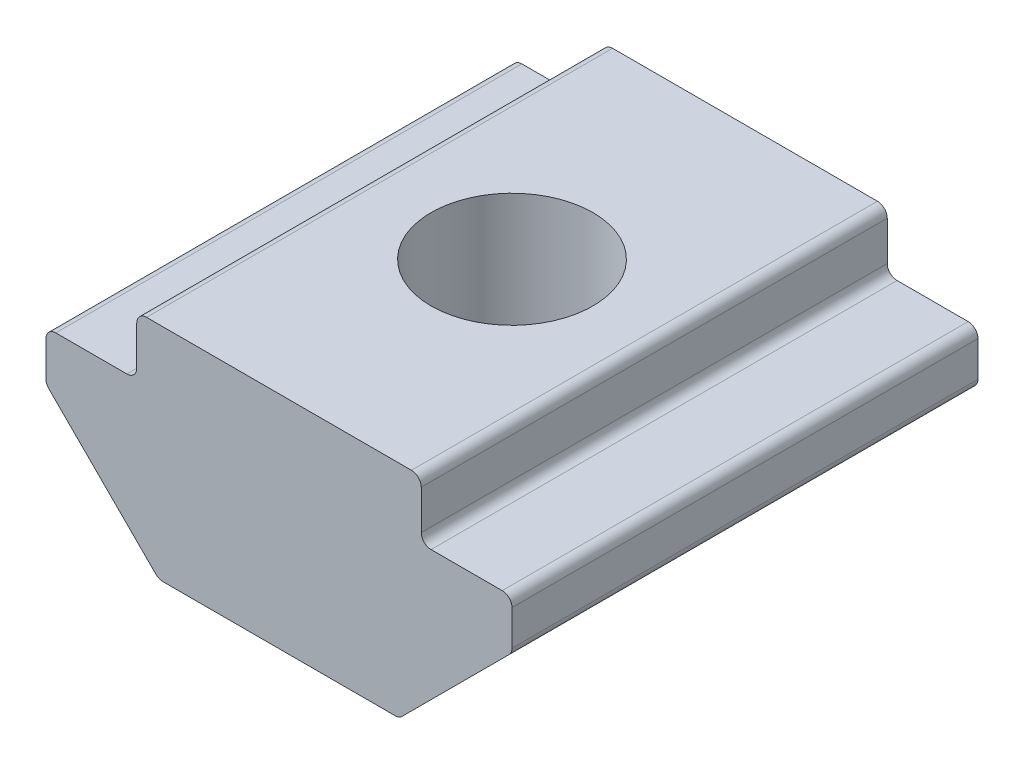
ISO-10303-21;
HEADER;
FILE_DESCRIPTION(('STEP AP214'),'2;1');
FILE_NAME('part.step','',(''),(''),'','','');
FILE_SCHEMA(('AUTOMOTIVE_DESIGN { 1 0 10303 214 1 1 1 1 }'));
ENDSEC;
DATA;
#1=APPLICATION_CONTEXT('core data for automotive mechanical design processes');
#2=APPLICATION_PROTOCOL_DEFINITION('international standard','automotive_design',2000,#1);
#3=PRODUCT_CONTEXT('',#1,'mechanical');
#4=PRODUCT('Part','Part','',(#3));
#5=PRODUCT_RELATED_PRODUCT_CATEGORY('part','',(#4));
#6=PRODUCT_DEFINITION_FORMATION('','',#4);
#7=PRODUCT_DEFINITION_CONTEXT('part definition',#1,'design');
#8=PRODUCT_DEFINITION('design','',#6,#7);
#9=PRODUCT_DEFINITION_SHAPE('','',#8);
#10=(LENGTH_UNIT() NAMED_UNIT(*) SI_UNIT(.MILLI.,.METRE.));
#11=(NAMED_UNIT(*) PLANE_ANGLE_UNIT() SI_UNIT($,.RADIAN.));
#12=(NAMED_UNIT(*) SI_UNIT($,.STERADIAN.) SOLID_ANGLE_UNIT());
#13=UNCERTAINTY_MEASURE_WITH_UNIT(LENGTH_MEASURE(1.E-05),#10,'distance_accuracy_value','');
#14=(GEOMETRIC_REPRESENTATION_CONTEXT(3) GLOBAL_UNCERTAINTY_ASSIGNED_CONTEXT((#13)) GLOBAL_UNIT_ASSIGNED_CONTEXT((#10,
#11,#12)) REPRESENTATION_CONTEXT('',''));
#15=CARTESIAN_POINT('',(0.,0.,0.));
#16=DIRECTION('',(0.,0.,1.));
#17=DIRECTION('',(1.,0.,0.));
#18=AXIS2_PLACEMENT_3D('',#15,#16,#17);
#19=CARTESIAN_POINT('',(-2.9,0.,4.75));
#20=DIRECTION('',(1.,0.,0.));
#21=DIRECTION('',(0.,1.,0.));
#22=AXIS2_PLACEMENT_3D('',#19,#20,#21);
#23=PLANE('',#22);
#24=DIRECTION('',(0.,-1.,0.));
#25=VECTOR('',#24,1.);
#26=CARTESIAN_POINT('',(-2.9,0.,-4.75));
#27=LINE('',#26,#25);
#28=CARTESIAN_POINT('',(-2.9,-0.2,-4.75));
#29=VERTEX_POINT('',#28);
#30=CARTESIAN_POINT('',(-2.9,-1.,-4.75));
#31=VERTEX_POINT('',#30);
#32=EDGE_CURVE('E183',#29,#31,#27,.T.);
#33=ORIENTED_EDGE('',*,*,#32,.T.);
#34=DIRECTION('',(0.,0.,-1.));
#35=VECTOR('',#34,1.);
#36=CARTESIAN_POINT('',(-2.9,-1.,4.75));
#37=LINE('',#36,#35);
#38=CARTESIAN_POINT('',(-2.9,-1.,4.75));
#39=VERTEX_POINT('',#38);
#40=EDGE_CURVE('E160',#31,#39,#37,.F.);
#41=ORIENTED_EDGE('',*,*,#40,.T.);
#42=DIRECTION('',(0.,-1.,0.));
#43=VECTOR('',#42,1.);
#44=CARTESIAN_POINT('',(-2.9,0.,4.75));
#45=LINE('',#44,#43);
#46=CARTESIAN_POINT('',(-2.9,-0.2,4.75));
#47=VERTEX_POINT('',#46);
#48=EDGE_CURVE('E211',#47,#39,#45,.T.);
#49=ORIENTED_EDGE('',*,*,#48,.F.);
#50=DIRECTION('',(0.,0.,-1.));
#51=VECTOR('',#50,1.);
#52=CARTESIAN_POINT('',(-2.9,-0.2,4.75));
#53=LINE('',#52,#51);
#54=EDGE_CURVE('E175',#47,#29,#53,.T.);
#55=ORIENTED_EDGE('',*,*,#54,.T.);
#56=EDGE_LOOP('',(#33,#41,#49,#55));
#57=FACE_BOUND('',#56,.T.);
#58=ADVANCED_FACE('F17',(#57),#23,.F.);
#59=CARTESIAN_POINT('',(-2.9,-1.2,4.75));
#60=DIRECTION('',(0.,-1.,0.));
#61=DIRECTION('',(1.,0.,0.));
#62=AXIS2_PLACEMENT_3D('',#59,#60,#61);
#63=PLANE('',#62);
#64=DIRECTION('',(-1.,0.,0.));
#65=VECTOR('',#64,1.);
#66=CARTESIAN_POINT('',(-2.9,-1.2,4.75));
#67=LINE('',#66,#65);
#68=CARTESIAN_POINT('',(-3.1,-1.2,4.75));
#69=VERTEX_POINT('',#68);
#70=CARTESIAN_POINT('',(-4.55,-1.2,4.75));
#71=VERTEX_POINT('',#70);
#72=EDGE_CURVE('E174',#69,#71,#67,.T.);
#73=ORIENTED_EDGE('',*,*,#72,.F.);
#74=DIRECTION('',(0.,0.,-1.));
#75=VECTOR('',#74,1.);
#76=CARTESIAN_POINT('',(-3.1,-1.2,-4.75));
#77=LINE('',#76,#75);
#78=CARTESIAN_POINT('',(-3.1,-1.2,-4.75));
#79=VERTEX_POINT('',#78);
#80=EDGE_CURVE('E159',#69,#79,#77,.T.);
#81=ORIENTED_EDGE('',*,*,#80,.T.);
#82=DIRECTION('',(-1.,0.,0.));
#83=VECTOR('',#82,1.);
#84=CARTESIAN_POINT('',(-2.9,-1.2,-4.75));
#85=LINE('',#84,#83);
#86=CARTESIAN_POINT('',(-4.55,-1.2,-4.75));
#87=VERTEX_POINT('',#86);
#88=EDGE_CURVE('E171',#79,#87,#85,.T.);
#89=ORIENTED_EDGE('',*,*,#88,.T.);
#90=DIRECTION('',(0.,0.,-1.));
#91=VECTOR('',#90,1.);
#92=CARTESIAN_POINT('',(-4.55,-1.2,4.75));
#93=LINE('',#92,#91);
#94=EDGE_CURVE('E176',#87,#71,#93,.F.);
#95=ORIENTED_EDGE('',*,*,#94,.T.);
#96=EDGE_LOOP('',(#73,#81,#89,#95));
#97=FACE_BOUND('',#96,.T.);
#98=ADVANCED_FACE('F170',(#97),#63,.F.);
#99=CARTESIAN_POINT('',(-4.75,-1.2,4.75));
#100=DIRECTION('',(1.,0.,0.));
#101=DIRECTION('',(0.,0.,-1.));
#102=AXIS2_PLACEMENT_3D('',#99,#100,#101);
#103=PLANE('',#102);
#104=DIRECTION('',(0.,-1.,0.));
#105=VECTOR('',#104,1.);
#106=CARTESIAN_POINT('',(-4.75,-1.2,-4.75));
#107=LINE('',#106,#105);
#108=CARTESIAN_POINT('',(-4.75,-1.4,-4.75));
#109=VERTEX_POINT('',#108);
#110=CARTESIAN_POINT('',(-4.75,-2.11715728752538,-4.75));
#111=VERTEX_POINT('',#110);
#112=EDGE_CURVE('E182',#109,#111,#107,.T.);
#113=ORIENTED_EDGE('',*,*,#112,.T.);
#114=DIRECTION('',(0.,0.,-1.));
#115=VECTOR('',#114,1.);
#116=CARTESIAN_POINT('',(-4.75,-2.11715728752538,4.75));
#117=LINE('',#116,#115);
#118=CARTESIAN_POINT('',(-4.75,-2.11715728752538,4.75));
#119=VERTEX_POINT('',#118);
#120=EDGE_CURVE('E250',#111,#119,#117,.F.);
#121=ORIENTED_EDGE('',*,*,#120,.T.);
#122=DIRECTION('',(0.,-1.,0.));
#123=VECTOR('',#122,1.);
#124=CARTESIAN_POINT('',(-4.75,-1.2,4.75));
#125=LINE('',#124,#123);
#126=CARTESIAN_POINT('',(-4.75,-1.4,4.75));
#127=VERTEX_POINT('',#126);
#128=EDGE_CURVE('E321',#127,#119,#125,.T.);
#129=ORIENTED_EDGE('',*,*,#128,.F.);
#130=DIRECTION('',(0.,0.,-1.));
#131=VECTOR('',#130,1.);
#132=CARTESIAN_POINT('',(-4.75,-1.4,4.75));
#133=LINE('',#132,#131);
#134=EDGE_CURVE('E247',#127,#109,#133,.T.);
#135=ORIENTED_EDGE('',*,*,#134,.T.);
#136=EDGE_LOOP('',(#113,#121,#129,#135));
#137=FACE_BOUND('',#136,.T.);
#138=ADVANCED_FACE('F352',(#137),#103,.F.);
#139=CARTESIAN_POINT('',(-4.75,-2.2,4.75));
#140=DIRECTION('',(0.707106781186546,0.707106781186549,0.));
#141=DIRECTION('',(-0.707106781186549,0.707106781186546,0.));
#142=AXIS2_PLACEMENT_3D('',#139,#140,#141);
#143=PLANE('',#142);
#144=DIRECTION('',(0.707106781186549,-0.707106781186546,0.));
#145=VECTOR('',#144,1.);
#146=CARTESIAN_POINT('',(-4.75,-2.2,4.75));
#147=LINE('',#146,#145);
#148=CARTESIAN_POINT('',(-4.69142135623731,-2.25857864376269,4.75));
#149=VERTEX_POINT('',#148);
#150=CARTESIAN_POINT('',(-2.50857864376268,-4.44142135623731,4.75));
#151=VERTEX_POINT('',#150);
#152=EDGE_CURVE('E318',#149,#151,#147,.T.);
#153=ORIENTED_EDGE('',*,*,#152,.F.);
#154=DIRECTION('',(0.,0.,-1.));
#155=VECTOR('',#154,1.);
#156=CARTESIAN_POINT('',(-4.69142135623731,-2.25857864376269,4.75));
#157=LINE('',#156,#155);
#158=CARTESIAN_POINT('',(-4.69142135623731,-2.25857864376269,-4.75));
#159=VERTEX_POINT('',#158);
#160=EDGE_CURVE('E229',#149,#159,#157,.T.);
#161=ORIENTED_EDGE('',*,*,#160,.T.);
#162=DIRECTION('',(0.707106781186549,-0.707106781186546,0.));
#163=VECTOR('',#162,1.);
#164=CARTESIAN_POINT('',(-4.75,-2.2,-4.75));
#165=LINE('',#164,#163);
#166=CARTESIAN_POINT('',(-2.50857864376268,-4.44142135623731,-4.75));
#167=VERTEX_POINT('',#166);
#168=EDGE_CURVE('E186',#159,#167,#165,.T.);
#169=ORIENTED_EDGE('',*,*,#168,.T.);
#170=DIRECTION('',(0.,0.,-1.));
#171=VECTOR('',#170,1.);
#172=CARTESIAN_POINT('',(-2.50857864376268,-4.44142135623731,4.75));
#173=LINE('',#172,#171);
#174=EDGE_CURVE('E227',#167,#151,#173,.F.);
#175=ORIENTED_EDGE('',*,*,#174,.T.);
#176=EDGE_LOOP('',(#153,#161,#169,#175));
#177=FACE_BOUND('',#176,.T.);
#178=ADVANCED_FACE('F527',(#177),#143,.F.);
#179=CARTESIAN_POINT('',(-2.45,-4.5,4.75));
#180=DIRECTION('',(0.,1.,0.));
#181=DIRECTION('',(-1.,0.,0.));
#182=AXIS2_PLACEMENT_3D('',#179,#180,#181);
#183=PLANE('',#182);
#184=CARTESIAN_POINT('',(0.,-4.5,0.));
#185=DIRECTION('',(0.,1.,0.));
#186=DIRECTION('',(0.,0.,1.));
#187=AXIS2_PLACEMENT_3D('',#184,#185,#186);
#188=CIRCLE('',#187,1.65);
#189=CARTESIAN_POINT('',(0.,-4.5,1.65));
#190=VERTEX_POINT('',#189);
#191=EDGE_CURVE('E188',#190,#190,#188,.T.);
#192=ORIENTED_EDGE('',*,*,#191,.T.);
#193=EDGE_LOOP('',(#192));
#194=FACE_BOUND('',#193,.T.);
#195=DIRECTION('',(1.,0.,0.));
#196=VECTOR('',#195,1.);
#197=CARTESIAN_POINT('',(-2.45,-4.5,4.75));
#198=LINE('',#197,#196);
#199=CARTESIAN_POINT('',(-2.36715728752537,-4.5,4.75));
#200=VERTEX_POINT('',#199);
#201=CARTESIAN_POINT('',(2.36715728752537,-4.5,4.75));
#202=VERTEX_POINT('',#201);
#203=EDGE_CURVE('E315',#200,#202,#198,.T.);
#204=ORIENTED_EDGE('',*,*,#203,.F.);
#205=DIRECTION('',(0.,0.,-1.));
#206=VECTOR('',#205,1.);
#207=CARTESIAN_POINT('',(-2.36715728752537,-4.5,4.75));
#208=LINE('',#207,#206);
#209=CARTESIAN_POINT('',(-2.36715728752537,-4.5,-4.75));
#210=VERTEX_POINT('',#209);
#211=EDGE_CURVE('E269',#200,#210,#208,.T.);
#212=ORIENTED_EDGE('',*,*,#211,.T.);
#213=DIRECTION('',(1.,0.,0.));
#214=VECTOR('',#213,1.);
#215=CARTESIAN_POINT('',(-2.45,-4.5,-4.75));
#216=LINE('',#215,#214);
#217=CARTESIAN_POINT('',(2.36715728752537,-4.5,-4.75));
#218=VERTEX_POINT('',#217);
#219=EDGE_CURVE('E194',#210,#218,#216,.T.);
#220=ORIENTED_EDGE('',*,*,#219,.T.);
#221=DIRECTION('',(0.,0.,-1.));
#222=VECTOR('',#221,1.);
#223=CARTESIAN_POINT('',(2.36715728752537,-4.5,4.75));
#224=LINE('',#223,#222);
#225=EDGE_CURVE('E267',#218,#202,#224,.F.);
#226=ORIENTED_EDGE('',*,*,#225,.T.);
#227=EDGE_LOOP('',(#204,#212,#220,#226));
#228=FACE_BOUND('',#227,.T.);
#229=ADVANCED_FACE('F517',(#194,#228),#183,.F.);
#230=CARTESIAN_POINT('',(4.75,-2.2,4.75));
#231=DIRECTION('',(-0.707106781186546,0.707106781186549,0.));
#232=DIRECTION('',(-0.707106781186549,-0.707106781186546,0.));
#233=AXIS2_PLACEMENT_3D('',#230,#231,#232);
#234=PLANE('',#233);
#235=DIRECTION('',(0.707106781186549,0.707106781186546,0.));
#236=VECTOR('',#235,1.);
#237=CARTESIAN_POINT('',(4.75,-2.2,4.75));
#238=LINE('',#237,#236);
#239=CARTESIAN_POINT('',(2.50857864376268,-4.44142135623731,4.75));
#240=VERTEX_POINT('',#239);
#241=CARTESIAN_POINT('',(4.69142135623731,-2.25857864376269,4.75));
#242=VERTEX_POINT('',#241);
#243=EDGE_CURVE('E312',#240,#242,#238,.T.);
#244=ORIENTED_EDGE('',*,*,#243,.F.);
#245=DIRECTION('',(0.,0.,-1.));
#246=VECTOR('',#245,1.);
#247=CARTESIAN_POINT('',(2.50857864376268,-4.44142135623731,4.75));
#248=LINE('',#247,#246);
#249=CARTESIAN_POINT('',(2.50857864376268,-4.44142135623731,-4.75));
#250=VERTEX_POINT('',#249);
#251=EDGE_CURVE('E274',#240,#250,#248,.T.);
#252=ORIENTED_EDGE('',*,*,#251,.T.);
#253=DIRECTION('',(0.707106781186549,0.707106781186546,0.));
#254=VECTOR('',#253,1.);
#255=CARTESIAN_POINT('',(4.75,-2.2,-4.75));
#256=LINE('',#255,#254);
#257=CARTESIAN_POINT('',(4.69142135623731,-2.25857864376269,-4.75));
#258=VERTEX_POINT('',#257);
#259=EDGE_CURVE('E197',#250,#258,#256,.T.);
#260=ORIENTED_EDGE('',*,*,#259,.T.);
#261=DIRECTION('',(0.,0.,-1.));
#262=VECTOR('',#261,1.);
#263=CARTESIAN_POINT('',(4.69142135623731,-2.25857864376269,4.75));
#264=LINE('',#263,#262);
#265=EDGE_CURVE('E272',#258,#242,#264,.F.);
#266=ORIENTED_EDGE('',*,*,#265,.T.);
#267=EDGE_LOOP('',(#244,#252,#260,#266));
#268=FACE_BOUND('',#267,.T.);
#269=ADVANCED_FACE('F507',(#268),#234,.F.);
#270=CARTESIAN_POINT('',(4.75,-1.2,4.75));
#271=DIRECTION('',(-1.,0.,0.));
#272=DIRECTION('',(0.,0.,1.));
#273=AXIS2_PLACEMENT_3D('',#270,#271,#272);
#274=PLANE('',#273);
#275=DIRECTION('',(0.,1.,0.));
#276=VECTOR('',#275,1.);
#277=CARTESIAN_POINT('',(4.75,-1.2,4.75));
#278=LINE('',#277,#276);
#279=CARTESIAN_POINT('',(4.75,-2.11715728752538,4.75));
#280=VERTEX_POINT('',#279);
#281=CARTESIAN_POINT('',(4.75,-1.4,4.75));
#282=VERTEX_POINT('',#281);
#283=EDGE_CURVE('E307',#280,#282,#278,.T.);
#284=ORIENTED_EDGE('',*,*,#283,.F.);
#285=DIRECTION('',(0.,0.,-1.));
#286=VECTOR('',#285,1.);
#287=CARTESIAN_POINT('',(4.75,-2.11715728752538,4.75));
#288=LINE('',#287,#286);
#289=CARTESIAN_POINT('',(4.75,-2.11715728752538,-4.75));
#290=VERTEX_POINT('',#289);
#291=EDGE_CURVE('E279',#280,#290,#288,.T.);
#292=ORIENTED_EDGE('',*,*,#291,.T.);
#293=DIRECTION('',(0.,1.,0.));
#294=VECTOR('',#293,1.);
#295=CARTESIAN_POINT('',(4.75,-1.2,-4.75));
#296=LINE('',#295,#294);
#297=CARTESIAN_POINT('',(4.75,-1.4,-4.75));
#298=VERTEX_POINT('',#297);
#299=EDGE_CURVE('E200',#290,#298,#296,.T.);
#300=ORIENTED_EDGE('',*,*,#299,.T.);
#301=DIRECTION('',(0.,0.,-1.));
#302=VECTOR('',#301,1.);
#303=CARTESIAN_POINT('',(4.75,-1.4,4.75));
#304=LINE('',#303,#302);
#305=EDGE_CURVE('E277',#298,#282,#304,.F.);
#306=ORIENTED_EDGE('',*,*,#305,.T.);
#307=EDGE_LOOP('',(#284,#292,#300,#306));
#308=FACE_BOUND('',#307,.T.);
#309=ADVANCED_FACE('F498',(#308),#274,.F.);
#310=CARTESIAN_POINT('',(2.9,-1.2,4.75));
#311=DIRECTION('',(0.,-1.,0.));
#312=DIRECTION('',(1.,0.,0.));
#313=AXIS2_PLACEMENT_3D('',#310,#311,#312);
#314=PLANE('',#313);
#315=DIRECTION('',(-1.,0.,0.));
#316=VECTOR('',#315,1.);
#317=CARTESIAN_POINT('',(2.9,-1.2,-4.75));
#318=LINE('',#317,#316);
#319=CARTESIAN_POINT('',(4.55,-1.2,-4.75));
#320=VERTEX_POINT('',#319);
#321=CARTESIAN_POINT('',(3.1,-1.2,-4.75));
#322=VERTEX_POINT('',#321);
#323=EDGE_CURVE('E203',#320,#322,#318,.T.);
#324=ORIENTED_EDGE('',*,*,#323,.T.);
#325=DIRECTION('',(0.,0.,-1.));
#326=VECTOR('',#325,1.);
#327=CARTESIAN_POINT('',(3.1,-1.2,4.75));
#328=LINE('',#327,#326);
#329=CARTESIAN_POINT('',(3.1,-1.2,4.75));
#330=VERTEX_POINT('',#329);
#331=EDGE_CURVE('E225',#322,#330,#328,.F.);
#332=ORIENTED_EDGE('',*,*,#331,.T.);
#333=DIRECTION('',(-1.,0.,0.));
#334=VECTOR('',#333,1.);
#335=CARTESIAN_POINT('',(2.9,-1.2,4.75));
#336=LINE('',#335,#334);
#337=CARTESIAN_POINT('',(4.55,-1.2,4.75));
#338=VERTEX_POINT('',#337);
#339=EDGE_CURVE('E302',#338,#330,#336,.T.);
#340=ORIENTED_EDGE('',*,*,#339,.F.);
#341=DIRECTION('',(0.,0.,-1.));
#342=VECTOR('',#341,1.);
#343=CARTESIAN_POINT('',(4.55,-1.2,4.75));
#344=LINE('',#343,#342);
#345=EDGE_CURVE('E222',#338,#320,#344,.T.);
#346=ORIENTED_EDGE('',*,*,#345,.T.);
#347=EDGE_LOOP('',(#324,#332,#340,#346));
#348=FACE_BOUND('',#347,.T.);
#349=ADVANCED_FACE('F292',(#348),#314,.F.);
#350=CARTESIAN_POINT('',(2.9,0.,4.75));
#351=DIRECTION('',(-1.,0.,0.));
#352=DIRECTION('',(0.,-1.,0.));
#353=AXIS2_PLACEMENT_3D('',#350,#351,#352);
#354=PLANE('',#353);
#355=DIRECTION('',(0.,1.,0.));
#356=VECTOR('',#355,1.);
#357=CARTESIAN_POINT('',(2.9,0.,4.75));
#358=LINE('',#357,#356);
#359=CARTESIAN_POINT('',(2.9,-1.,4.75));
#360=VERTEX_POINT('',#359);
#361=CARTESIAN_POINT('',(2.9,-0.2,4.75));
#362=VERTEX_POINT('',#361);
#363=EDGE_CURVE('E301',#360,#362,#358,.T.);
#364=ORIENTED_EDGE('',*,*,#363,.F.);
#365=DIRECTION('',(0.,0.,-1.));
#366=VECTOR('',#365,1.);
#367=CARTESIAN_POINT('',(2.9,-1.,-4.75));
#368=LINE('',#367,#366);
#369=CARTESIAN_POINT('',(2.9,-1.,-4.75));
#370=VERTEX_POINT('',#369);
#371=EDGE_CURVE('E219',#360,#370,#368,.T.);
#372=ORIENTED_EDGE('',*,*,#371,.T.);
#373=DIRECTION('',(0.,1.,0.));
#374=VECTOR('',#373,1.);
#375=CARTESIAN_POINT('',(2.9,0.,-4.75));
#376=LINE('',#375,#374);
#377=CARTESIAN_POINT('',(2.9,-0.2,-4.75));
#378=VERTEX_POINT('',#377);
#379=EDGE_CURVE('E206',#370,#378,#376,.T.);
#380=ORIENTED_EDGE('',*,*,#379,.T.);
#381=DIRECTION('',(0.,0.,-1.));
#382=VECTOR('',#381,1.);
#383=CARTESIAN_POINT('',(2.9,-0.2,4.75));
#384=LINE('',#383,#382);
#385=EDGE_CURVE('E217',#378,#362,#384,.F.);
#386=ORIENTED_EDGE('',*,*,#385,.T.);
#387=EDGE_LOOP('',(#364,#372,#380,#386));
#388=FACE_BOUND('',#387,.T.);
#389=ADVANCED_FACE('F304',(#388),#354,.F.);
#390=CARTESIAN_POINT('',(-2.9,0.,4.75));
#391=DIRECTION('',(0.,-1.,0.));
#392=DIRECTION('',(0.,0.,-1.));
#393=AXIS2_PLACEMENT_3D('',#390,#391,#392);
#394=PLANE('',#393);
#395=CARTESIAN_POINT('',(0.,0.,0.));
#396=DIRECTION('',(0.,1.,0.));
#397=DIRECTION('',(0.,0.,1.));
#398=AXIS2_PLACEMENT_3D('',#395,#396,#397);
#399=CIRCLE('',#398,1.65);
#400=CARTESIAN_POINT('',(0.,0.,1.65));
#401=VERTEX_POINT('',#400);
#402=EDGE_CURVE('E328',#401,#401,#399,.T.);
#403=ORIENTED_EDGE('',*,*,#402,.F.);
#404=EDGE_LOOP('',(#403));
#405=FACE_BOUND('',#404,.T.);
#406=DIRECTION('',(-1.,0.,0.));
#407=VECTOR('',#406,1.);
#408=CARTESIAN_POINT('',(-2.9,0.,-4.75));
#409=LINE('',#408,#407);
#410=CARTESIAN_POINT('',(2.7,0.,-4.75));
#411=VERTEX_POINT('',#410);
#412=CARTESIAN_POINT('',(-2.7,0.,-4.75));
#413=VERTEX_POINT('',#412);
#414=EDGE_CURVE('E209',#411,#413,#409,.T.);
#415=ORIENTED_EDGE('',*,*,#414,.T.);
#416=DIRECTION('',(0.,0.,-1.));
#417=VECTOR('',#416,1.);
#418=CARTESIAN_POINT('',(-2.7,0.,4.75));
#419=LINE('',#418,#417);
#420=CARTESIAN_POINT('',(-2.7,0.,4.75));
#421=VERTEX_POINT('',#420);
#422=EDGE_CURVE('E32',#413,#421,#419,.F.);
#423=ORIENTED_EDGE('',*,*,#422,.T.);
#424=DIRECTION('',(-1.,0.,0.));
#425=VECTOR('',#424,1.);
#426=CARTESIAN_POINT('',(-2.9,0.,4.75));
#427=LINE('',#426,#425);
#428=CARTESIAN_POINT('',(2.7,0.,4.75));
#429=VERTEX_POINT('',#428);
#430=EDGE_CURVE('E212',#429,#421,#427,.T.);
#431=ORIENTED_EDGE('',*,*,#430,.F.);
#432=DIRECTION('',(0.,0.,-1.));
#433=VECTOR('',#432,1.);
#434=CARTESIAN_POINT('',(2.7,0.,4.75));
#435=LINE('',#434,#433);
#436=EDGE_CURVE('E282',#429,#411,#435,.T.);
#437=ORIENTED_EDGE('',*,*,#436,.T.);
#438=EDGE_LOOP('',(#415,#423,#431,#437));
#439=FACE_BOUND('',#438,.T.);
#440=ADVANCED_FACE('F334',(#405,#439),#394,.F.);
#441=CARTESIAN_POINT('',(0.,0.,4.75));
#442=DIRECTION('',(0.,0.,-1.));
#443=DIRECTION('',(-1.,0.,0.));
#444=AXIS2_PLACEMENT_3D('',#441,#442,#443);
#445=PLANE('',#444);
#446=ORIENTED_EDGE('',*,*,#128,.T.);
#447=CARTESIAN_POINT('',(-4.55,-2.11715728752538,4.75));
#448=DIRECTION('',(0.,0.,-1.));
#449=DIRECTION('',(-1.,0.,0.));
#450=AXIS2_PLACEMENT_3D('',#447,#448,#449);
#451=CIRCLE('',#450,0.2);
#452=EDGE_CURVE('E265',#119,#149,#451,.F.);
#453=ORIENTED_EDGE('',*,*,#452,.T.);
#454=ORIENTED_EDGE('',*,*,#152,.T.);
#455=CARTESIAN_POINT('',(-2.36715728752537,-4.3,4.75));
#456=DIRECTION('',(0.,0.,-1.));
#457=DIRECTION('',(-1.,0.,0.));
#458=AXIS2_PLACEMENT_3D('',#455,#456,#457);
#459=CIRCLE('',#458,0.2);
#460=EDGE_CURVE('E263',#151,#200,#459,.F.);
#461=ORIENTED_EDGE('',*,*,#460,.T.);
#462=ORIENTED_EDGE('',*,*,#203,.T.);
#463=CARTESIAN_POINT('',(2.36715728752537,-4.3,4.75));
#464=DIRECTION('',(0.,0.,-1.));
#465=DIRECTION('',(-1.,0.,0.));
#466=AXIS2_PLACEMENT_3D('',#463,#464,#465);
#467=CIRCLE('',#466,0.2);
#468=EDGE_CURVE('E261',#202,#240,#467,.F.);
#469=ORIENTED_EDGE('',*,*,#468,.T.);
#470=ORIENTED_EDGE('',*,*,#243,.T.);
#471=CARTESIAN_POINT('',(4.55,-2.11715728752538,4.75));
#472=DIRECTION('',(0.,0.,-1.));
#473=DIRECTION('',(-1.,0.,0.));
#474=AXIS2_PLACEMENT_3D('',#471,#472,#473);
#475=CIRCLE('',#474,0.2);
#476=EDGE_CURVE('E259',#242,#280,#475,.F.);
#477=ORIENTED_EDGE('',*,*,#476,.T.);
#478=ORIENTED_EDGE('',*,*,#283,.T.);
#479=CARTESIAN_POINT('',(4.55,-1.4,4.75));
#480=DIRECTION('',(0.,0.,-1.));
#481=DIRECTION('',(-1.,0.,0.));
#482=AXIS2_PLACEMENT_3D('',#479,#480,#481);
#483=CIRCLE('',#482,0.2);
#484=EDGE_CURVE('E257',#282,#338,#483,.F.);
#485=ORIENTED_EDGE('',*,*,#484,.T.);
#486=ORIENTED_EDGE('',*,*,#339,.T.);
#487=CARTESIAN_POINT('',(3.1,-1.,4.75));
#488=DIRECTION('',(0.,0.,-1.));
#489=DIRECTION('',(-1.,0.,0.));
#490=AXIS2_PLACEMENT_3D('',#487,#488,#489);
#491=CIRCLE('',#490,0.2);
#492=EDGE_CURVE('E11',#330,#360,#491,.T.);
#493=ORIENTED_EDGE('',*,*,#492,.T.);
#494=ORIENTED_EDGE('',*,*,#363,.T.);
#495=CARTESIAN_POINT('',(2.7,-0.2,4.75));
#496=DIRECTION('',(0.,0.,-1.));
#497=DIRECTION('',(-1.,0.,0.));
#498=AXIS2_PLACEMENT_3D('',#495,#496,#497);
#499=CIRCLE('',#498,0.2);
#500=EDGE_CURVE('E39',#362,#429,#499,.F.);
#501=ORIENTED_EDGE('',*,*,#500,.T.);
#502=ORIENTED_EDGE('',*,*,#430,.T.);
#503=CARTESIAN_POINT('',(-2.7,-0.2,4.75));
#504=DIRECTION('',(0.,0.,-1.));
#505=DIRECTION('',(-1.,0.,0.));
#506=AXIS2_PLACEMENT_3D('',#503,#504,#505);
#507=CIRCLE('',#506,0.2);
#508=EDGE_CURVE('E253',#421,#47,#507,.F.);
#509=ORIENTED_EDGE('',*,*,#508,.T.);
#510=ORIENTED_EDGE('',*,*,#48,.T.);
#511=CARTESIAN_POINT('',(-3.1,-1.,4.75));
#512=DIRECTION('',(0.,0.,-1.));
#513=DIRECTION('',(-1.,0.,0.));
#514=AXIS2_PLACEMENT_3D('',#511,#512,#513);
#515=CIRCLE('',#514,0.2);
#516=EDGE_CURVE('E165',#39,#69,#515,.T.);
#517=ORIENTED_EDGE('',*,*,#516,.T.);
#518=ORIENTED_EDGE('',*,*,#72,.T.);
#519=CARTESIAN_POINT('',(-4.55,-1.4,4.75));
#520=DIRECTION('',(0.,0.,-1.));
#521=DIRECTION('',(-1.,0.,0.));
#522=AXIS2_PLACEMENT_3D('',#519,#520,#521);
#523=CIRCLE('',#522,0.2);
#524=EDGE_CURVE('E255',#71,#127,#523,.F.);
#525=ORIENTED_EDGE('',*,*,#524,.T.);
#526=EDGE_LOOP('',(#446,#453,#454,#461,#462,#469,#470,#477,#478,#485,#486,#493,#494,#501,#502,
#509,#510,#517,#518,#525));
#527=FACE_BOUND('',#526,.T.);
#528=ADVANCED_FACE('F300',(#527),#445,.F.);
#529=CARTESIAN_POINT('',(0.,0.,-4.75));
#530=DIRECTION('',(0.,0.,-1.));
#531=DIRECTION('',(-1.,0.,0.));
#532=AXIS2_PLACEMENT_3D('',#529,#530,#531);
#533=PLANE('',#532);
#534=ORIENTED_EDGE('',*,*,#168,.F.);
#535=CARTESIAN_POINT('',(-4.55,-2.11715728752538,-4.75));
#536=DIRECTION('',(0.,0.,-1.));
#537=DIRECTION('',(-1.,0.,0.));
#538=AXIS2_PLACEMENT_3D('',#535,#536,#537);
#539=CIRCLE('',#538,0.2);
#540=EDGE_CURVE('E245',#159,#111,#539,.T.);
#541=ORIENTED_EDGE('',*,*,#540,.T.);
#542=ORIENTED_EDGE('',*,*,#112,.F.);
#543=CARTESIAN_POINT('',(-4.55,-1.4,-4.75));
#544=DIRECTION('',(0.,0.,-1.));
#545=DIRECTION('',(-1.,0.,0.));
#546=AXIS2_PLACEMENT_3D('',#543,#544,#545);
#547=CIRCLE('',#546,0.2);
#548=EDGE_CURVE('E181',#109,#87,#547,.T.);
#549=ORIENTED_EDGE('',*,*,#548,.T.);
#550=ORIENTED_EDGE('',*,*,#88,.F.);
#551=CARTESIAN_POINT('',(-3.1,-1.,-4.75));
#552=DIRECTION('',(0.,0.,-1.));
#553=DIRECTION('',(-1.,0.,0.));
#554=AXIS2_PLACEMENT_3D('',#551,#552,#553);
#555=CIRCLE('',#554,0.2);
#556=EDGE_CURVE('E155',#79,#31,#555,.F.);
#557=ORIENTED_EDGE('',*,*,#556,.T.);
#558=ORIENTED_EDGE('',*,*,#32,.F.);
#559=CARTESIAN_POINT('',(-2.7,-0.2,-4.75));
#560=DIRECTION('',(0.,0.,-1.));
#561=DIRECTION('',(-1.,0.,0.));
#562=AXIS2_PLACEMENT_3D('',#559,#560,#561);
#563=CIRCLE('',#562,0.2);
#564=EDGE_CURVE('E234',#29,#413,#563,.T.);
#565=ORIENTED_EDGE('',*,*,#564,.T.);
#566=ORIENTED_EDGE('',*,*,#414,.F.);
#567=CARTESIAN_POINT('',(2.7,-0.2,-4.75));
#568=DIRECTION('',(0.,0.,-1.));
#569=DIRECTION('',(-1.,0.,0.));
#570=AXIS2_PLACEMENT_3D('',#567,#568,#569);
#571=CIRCLE('',#570,0.2);
#572=EDGE_CURVE('E232',#411,#378,#571,.T.);
#573=ORIENTED_EDGE('',*,*,#572,.T.);
#574=ORIENTED_EDGE('',*,*,#379,.F.);
#575=CARTESIAN_POINT('',(3.1,-1.,-4.75));
#576=DIRECTION('',(0.,0.,-1.));
#577=DIRECTION('',(-1.,0.,0.));
#578=AXIS2_PLACEMENT_3D('',#575,#576,#577);
#579=CIRCLE('',#578,0.2);
#580=EDGE_CURVE('E25',#370,#322,#579,.F.);
#581=ORIENTED_EDGE('',*,*,#580,.T.);
#582=ORIENTED_EDGE('',*,*,#323,.F.);
#583=CARTESIAN_POINT('',(4.55,-1.4,-4.75));
#584=DIRECTION('',(0.,0.,-1.));
#585=DIRECTION('',(-1.,0.,0.));
#586=AXIS2_PLACEMENT_3D('',#583,#584,#585);
#587=CIRCLE('',#586,0.2);
#588=EDGE_CURVE('E237',#320,#298,#587,.T.);
#589=ORIENTED_EDGE('',*,*,#588,.T.);
#590=ORIENTED_EDGE('',*,*,#299,.F.);
#591=CARTESIAN_POINT('',(4.55,-2.11715728752538,-4.75));
#592=DIRECTION('',(0.,0.,-1.));
#593=DIRECTION('',(-1.,0.,0.));
#594=AXIS2_PLACEMENT_3D('',#591,#592,#593);
#595=CIRCLE('',#594,0.2);
#596=EDGE_CURVE('E239',#290,#258,#595,.T.);
#597=ORIENTED_EDGE('',*,*,#596,.T.);
#598=ORIENTED_EDGE('',*,*,#259,.F.);
#599=CARTESIAN_POINT('',(2.36715728752537,-4.3,-4.75));
#600=DIRECTION('',(0.,0.,-1.));
#601=DIRECTION('',(-1.,0.,0.));
#602=AXIS2_PLACEMENT_3D('',#599,#600,#601);
#603=CIRCLE('',#602,0.2);
#604=EDGE_CURVE('E241',#250,#218,#603,.T.);
#605=ORIENTED_EDGE('',*,*,#604,.T.);
#606=ORIENTED_EDGE('',*,*,#219,.F.);
#607=CARTESIAN_POINT('',(-2.36715728752537,-4.3,-4.75));
#608=DIRECTION('',(0.,0.,-1.));
#609=DIRECTION('',(-1.,0.,0.));
#610=AXIS2_PLACEMENT_3D('',#607,#608,#609);
#611=CIRCLE('',#610,0.2);
#612=EDGE_CURVE('E243',#210,#167,#611,.T.);
#613=ORIENTED_EDGE('',*,*,#612,.T.);
#614=EDGE_LOOP('',(#534,#541,#542,#549,#550,#557,#558,#565,#566,#573,#574,#581,#582,#589,#590,
#597,#598,#605,#606,#613));
#615=FACE_BOUND('',#614,.T.);
#616=ADVANCED_FACE('F179',(#615),#533,.T.);
#617=CARTESIAN_POINT('',(0.,0.,0.));
#618=DIRECTION('',(0.,1.,0.));
#619=DIRECTION('',(0.,0.,1.));
#620=AXIS2_PLACEMENT_3D('',#617,#618,#619);
#621=CYLINDRICAL_SURFACE('',#620,1.65);
#622=ORIENTED_EDGE('',*,*,#191,.F.);
#623=EDGE_LOOP('',(#622));
#624=FACE_BOUND('',#623,.T.);
#625=ORIENTED_EDGE('',*,*,#402,.T.);
#626=EDGE_LOOP('',(#625));
#627=FACE_BOUND('',#626,.T.);
#628=ADVANCED_FACE('F332',(#624,#627),#621,.F.);
#629=CARTESIAN_POINT('',(-3.1,-1.,4.75));
#630=DIRECTION('',(0.,0.,1.));
#631=DIRECTION('',(1.,0.,0.));
#632=AXIS2_PLACEMENT_3D('',#629,#630,#631);
#633=CYLINDRICAL_SURFACE('',#632,0.2);
#634=ORIENTED_EDGE('',*,*,#516,.F.);
#635=ORIENTED_EDGE('',*,*,#40,.F.);
#636=ORIENTED_EDGE('',*,*,#556,.F.);
#637=ORIENTED_EDGE('',*,*,#80,.F.);
#638=EDGE_LOOP('',(#634,#635,#636,#637));
#639=FACE_BOUND('',#638,.T.);
#640=ADVANCED_FACE('F158',(#639),#633,.F.);
#641=CARTESIAN_POINT('',(3.1,-1.,4.75));
#642=DIRECTION('',(0.,0.,1.));
#643=DIRECTION('',(1.,0.,0.));
#644=AXIS2_PLACEMENT_3D('',#641,#642,#643);
#645=CYLINDRICAL_SURFACE('',#644,0.2);
#646=ORIENTED_EDGE('',*,*,#492,.F.);
#647=ORIENTED_EDGE('',*,*,#331,.F.);
#648=ORIENTED_EDGE('',*,*,#580,.F.);
#649=ORIENTED_EDGE('',*,*,#371,.F.);
#650=EDGE_LOOP('',(#646,#647,#648,#649));
#651=FACE_BOUND('',#650,.T.);
#652=ADVANCED_FACE('F297',(#651),#645,.F.);
#653=CARTESIAN_POINT('',(-4.55,-2.11715728752538,4.75));
#654=DIRECTION('',(0.,0.,-1.));
#655=DIRECTION('',(-1.,0.,0.));
#656=AXIS2_PLACEMENT_3D('',#653,#654,#655);
#657=CYLINDRICAL_SURFACE('',#656,0.2);
#658=ORIENTED_EDGE('',*,*,#452,.F.);
#659=ORIENTED_EDGE('',*,*,#120,.F.);
#660=ORIENTED_EDGE('',*,*,#540,.F.);
#661=ORIENTED_EDGE('',*,*,#160,.F.);
#662=EDGE_LOOP('',(#658,#659,#660,#661));
#663=FACE_BOUND('',#662,.T.);
#664=ADVANCED_FACE('F360',(#663),#657,.T.);
#665=CARTESIAN_POINT('',(-2.36715728752537,-4.3,4.75));
#666=DIRECTION('',(0.,0.,-1.));
#667=DIRECTION('',(-1.,0.,0.));
#668=AXIS2_PLACEMENT_3D('',#665,#666,#667);
#669=CYLINDRICAL_SURFACE('',#668,0.2);
#670=ORIENTED_EDGE('',*,*,#460,.F.);
#671=ORIENTED_EDGE('',*,*,#174,.F.);
#672=ORIENTED_EDGE('',*,*,#612,.F.);
#673=ORIENTED_EDGE('',*,*,#211,.F.);
#674=EDGE_LOOP('',(#670,#671,#672,#673));
#675=FACE_BOUND('',#674,.T.);
#676=ADVANCED_FACE('F363',(#675),#669,.T.);
#677=CARTESIAN_POINT('',(2.36715728752537,-4.3,4.75));
#678=DIRECTION('',(0.,0.,-1.));
#679=DIRECTION('',(-1.,0.,0.));
#680=AXIS2_PLACEMENT_3D('',#677,#678,#679);
#681=CYLINDRICAL_SURFACE('',#680,0.2);
#682=ORIENTED_EDGE('',*,*,#468,.F.);
#683=ORIENTED_EDGE('',*,*,#225,.F.);
#684=ORIENTED_EDGE('',*,*,#604,.F.);
#685=ORIENTED_EDGE('',*,*,#251,.F.);
#686=EDGE_LOOP('',(#682,#683,#684,#685));
#687=FACE_BOUND('',#686,.T.);
#688=ADVANCED_FACE('F367',(#687),#681,.T.);
#689=CARTESIAN_POINT('',(4.55,-2.11715728752538,4.75));
#690=DIRECTION('',(0.,0.,-1.));
#691=DIRECTION('',(-1.,0.,0.));
#692=AXIS2_PLACEMENT_3D('',#689,#690,#691);
#693=CYLINDRICAL_SURFACE('',#692,0.2);
#694=ORIENTED_EDGE('',*,*,#476,.F.);
#695=ORIENTED_EDGE('',*,*,#265,.F.);
#696=ORIENTED_EDGE('',*,*,#596,.F.);
#697=ORIENTED_EDGE('',*,*,#291,.F.);
#698=EDGE_LOOP('',(#694,#695,#696,#697));
#699=FACE_BOUND('',#698,.T.);
#700=ADVANCED_FACE('F371',(#699),#693,.T.);
#701=CARTESIAN_POINT('',(4.55,-1.4,4.75));
#702=DIRECTION('',(0.,0.,-1.));
#703=DIRECTION('',(-1.,0.,0.));
#704=AXIS2_PLACEMENT_3D('',#701,#702,#703);
#705=CYLINDRICAL_SURFACE('',#704,0.2);
#706=ORIENTED_EDGE('',*,*,#484,.F.);
#707=ORIENTED_EDGE('',*,*,#305,.F.);
#708=ORIENTED_EDGE('',*,*,#588,.F.);
#709=ORIENTED_EDGE('',*,*,#345,.F.);
#710=EDGE_LOOP('',(#706,#707,#708,#709));
#711=FACE_BOUND('',#710,.T.);
#712=ADVANCED_FACE('F375',(#711),#705,.T.);
#713=CARTESIAN_POINT('',(-4.55,-1.4,4.75));
#714=DIRECTION('',(0.,0.,-1.));
#715=DIRECTION('',(-1.,0.,0.));
#716=AXIS2_PLACEMENT_3D('',#713,#714,#715);
#717=CYLINDRICAL_SURFACE('',#716,0.2);
#718=ORIENTED_EDGE('',*,*,#524,.F.);
#719=ORIENTED_EDGE('',*,*,#94,.F.);
#720=ORIENTED_EDGE('',*,*,#548,.F.);
#721=ORIENTED_EDGE('',*,*,#134,.F.);
#722=EDGE_LOOP('',(#718,#719,#720,#721));
#723=FACE_BOUND('',#722,.T.);
#724=ADVANCED_FACE('F379',(#723),#717,.T.);
#725=CARTESIAN_POINT('',(-2.7,-0.2,4.75));
#726=DIRECTION('',(0.,0.,-1.));
#727=DIRECTION('',(-1.,0.,0.));
#728=AXIS2_PLACEMENT_3D('',#725,#726,#727);
#729=CYLINDRICAL_SURFACE('',#728,0.2);
#730=ORIENTED_EDGE('',*,*,#508,.F.);
#731=ORIENTED_EDGE('',*,*,#422,.F.);
#732=ORIENTED_EDGE('',*,*,#564,.F.);
#733=ORIENTED_EDGE('',*,*,#54,.F.);
#734=EDGE_LOOP('',(#730,#731,#732,#733));
#735=FACE_BOUND('',#734,.T.);
#736=ADVANCED_FACE('F341',(#735),#729,.T.);
#737=CARTESIAN_POINT('',(2.7,-0.2,4.75));
#738=DIRECTION('',(0.,0.,-1.));
#739=DIRECTION('',(-1.,0.,0.));
#740=AXIS2_PLACEMENT_3D('',#737,#738,#739);
#741=CYLINDRICAL_SURFACE('',#740,0.2);
#742=ORIENTED_EDGE('',*,*,#500,.F.);
#743=ORIENTED_EDGE('',*,*,#385,.F.);
#744=ORIENTED_EDGE('',*,*,#572,.F.);
#745=ORIENTED_EDGE('',*,*,#436,.F.);
#746=EDGE_LOOP('',(#742,#743,#744,#745));
#747=FACE_BOUND('',#746,.T.);
#748=ADVANCED_FACE('F19',(#747),#741,.T.);
#749=CLOSED_SHELL('',(#58,#98,#138,#178,#229,#269,#309,#349,#389,#440,#528,#616,#628,#640,#652,
#664,#676,#688,#700,#712,#724,#736,#748));
#750=MANIFOLD_SOLID_BREP('B1',#749);
#751=ADVANCED_BREP_SHAPE_REPRESENTATION('',(#18,#750),#14);
#752=SHAPE_DEFINITION_REPRESENTATION(#9,#751);
ENDSEC;
END-ISO-10303-21;
